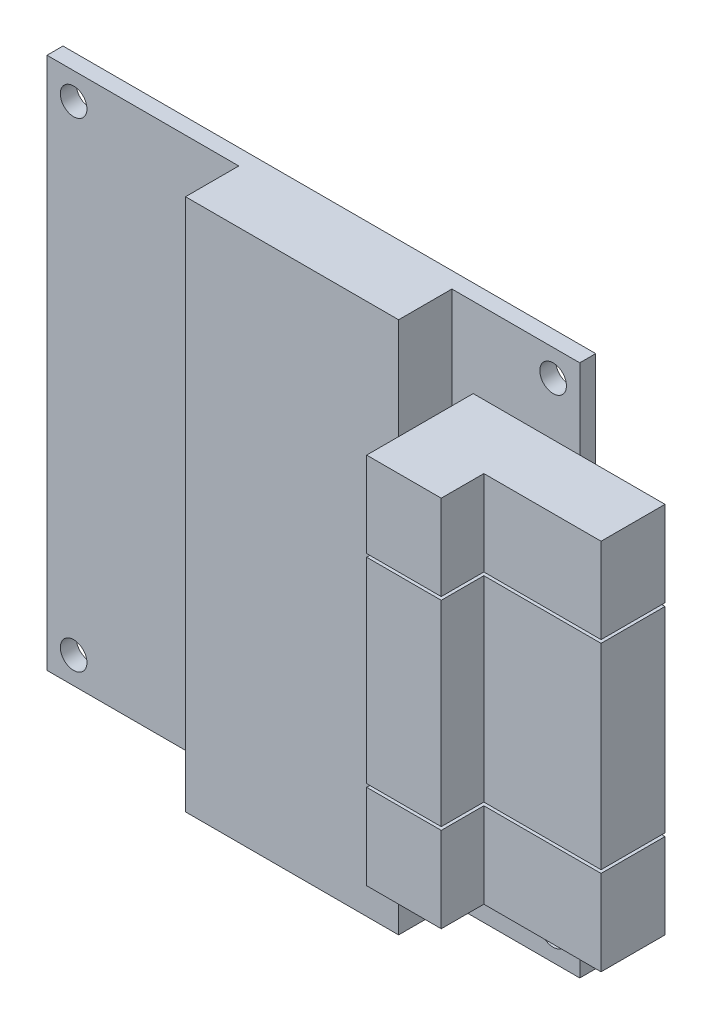
ISO-10303-21;
HEADER;
FILE_DESCRIPTION(('STEP AP214'),'2;1');
FILE_NAME('part.step','',(''),(''),'','','');
FILE_SCHEMA(('AUTOMOTIVE_DESIGN { 1 0 10303 214 1 1 1 1 }'));
ENDSEC;
DATA;
#1=APPLICATION_CONTEXT('core data for automotive mechanical design processes');
#2=APPLICATION_PROTOCOL_DEFINITION('international standard','automotive_design',2000,#1);
#3=PRODUCT_CONTEXT('',#1,'mechanical');
#4=PRODUCT('Part','Part','',(#3));
#5=PRODUCT_RELATED_PRODUCT_CATEGORY('part','',(#4));
#6=PRODUCT_DEFINITION_FORMATION('','',#4);
#7=PRODUCT_DEFINITION_CONTEXT('part definition',#1,'design');
#8=PRODUCT_DEFINITION('design','',#6,#7);
#9=PRODUCT_DEFINITION_SHAPE('','',#8);
#10=(LENGTH_UNIT() NAMED_UNIT(*) SI_UNIT(.MILLI.,.METRE.));
#11=(NAMED_UNIT(*) PLANE_ANGLE_UNIT() SI_UNIT($,.RADIAN.));
#12=(NAMED_UNIT(*) SI_UNIT($,.STERADIAN.) SOLID_ANGLE_UNIT());
#13=UNCERTAINTY_MEASURE_WITH_UNIT(LENGTH_MEASURE(1.E-05),#10,'distance_accuracy_value','');
#14=(GEOMETRIC_REPRESENTATION_CONTEXT(3) GLOBAL_UNCERTAINTY_ASSIGNED_CONTEXT((#13)) GLOBAL_UNIT_ASSIGNED_CONTEXT((#10,
#11,#12)) REPRESENTATION_CONTEXT('',''));
#15=CARTESIAN_POINT('',(0.,0.,0.));
#16=DIRECTION('',(0.,0.,1.));
#17=DIRECTION('',(1.,0.,0.));
#18=AXIS2_PLACEMENT_3D('',#15,#16,#17);
#19=CARTESIAN_POINT('',(0.,0.,1.5));
#20=DIRECTION('',(0.,0.,-1.));
#21=DIRECTION('',(-1.,0.,0.));
#22=AXIS2_PLACEMENT_3D('',#19,#20,#21);
#23=PLANE('',#22);
#24=CARTESIAN_POINT('',(22.5,-22.5,1.5));
#25=DIRECTION('',(0.,0.,1.));
#26=DIRECTION('',(1.,0.,0.));
#27=AXIS2_PLACEMENT_3D('',#24,#25,#26);
#28=CIRCLE('',#27,1.25);
#29=CARTESIAN_POINT('',(23.75,-22.5,1.5));
#30=VERTEX_POINT('',#29);
#31=EDGE_CURVE('E623',#30,#30,#28,.T.);
#32=ORIENTED_EDGE('',*,*,#31,.F.);
#33=EDGE_LOOP('',(#32));
#34=FACE_BOUND('',#33,.T.);
#35=CARTESIAN_POINT('',(22.5,22.5,1.5));
#36=DIRECTION('',(0.,0.,1.));
#37=DIRECTION('',(1.,0.,0.));
#38=AXIS2_PLACEMENT_3D('',#35,#36,#37);
#39=CIRCLE('',#38,1.25);
#40=CARTESIAN_POINT('',(23.75,22.5,1.5));
#41=VERTEX_POINT('',#40);
#42=EDGE_CURVE('E618',#41,#41,#39,.T.);
#43=ORIENTED_EDGE('',*,*,#42,.F.);
#44=EDGE_LOOP('',(#43));
#45=FACE_BOUND('',#44,.T.);
#46=DIRECTION('',(1.,0.,0.));
#47=VECTOR('',#46,1.);
#48=CARTESIAN_POINT('',(15.,-17.5,1.5));
#49=LINE('',#48,#47);
#50=CARTESIAN_POINT('',(15.,-17.5,1.5));
#51=VERTEX_POINT('',#50);
#52=CARTESIAN_POINT('',(25.,-17.5,1.5));
#53=VERTEX_POINT('',#52);
#54=EDGE_CURVE('E441',#51,#53,#49,.T.);
#55=ORIENTED_EDGE('',*,*,#54,.F.);
#56=DIRECTION('',(0.,-1.,0.));
#57=VECTOR('',#56,1.);
#58=CARTESIAN_POINT('',(15.,-17.5,1.5));
#59=LINE('',#58,#57);
#60=CARTESIAN_POINT('',(15.,-9.50000000000001,1.5));
#61=VERTEX_POINT('',#60);
#62=EDGE_CURVE('E267',#61,#51,#59,.T.);
#63=ORIENTED_EDGE('',*,*,#62,.F.);
#64=DIRECTION('',(-1.,0.,0.));
#65=VECTOR('',#64,1.);
#66=CARTESIAN_POINT('',(15.,-9.50000000000001,1.5));
#67=LINE('',#66,#65);
#68=CARTESIAN_POINT('',(25.,-9.50000000000001,1.5));
#69=VERTEX_POINT('',#68);
#70=EDGE_CURVE('E257',#69,#61,#67,.T.);
#71=ORIENTED_EDGE('',*,*,#70,.F.);
#72=DIRECTION('',(0.,1.,0.));
#73=VECTOR('',#72,1.);
#74=CARTESIAN_POINT('',(25.,25.,1.5));
#75=LINE('',#74,#73);
#76=CARTESIAN_POINT('',(25.,-9.2,1.5));
#77=VERTEX_POINT('',#76);
#78=EDGE_CURVE('E357',#69,#77,#75,.T.);
#79=ORIENTED_EDGE('',*,*,#78,.T.);
#80=DIRECTION('',(1.,0.,0.));
#81=VECTOR('',#80,1.);
#82=CARTESIAN_POINT('',(15.,-9.2,1.5));
#83=LINE('',#82,#81);
#84=CARTESIAN_POINT('',(15.,-9.2,1.5));
#85=VERTEX_POINT('',#84);
#86=EDGE_CURVE('E283',#85,#77,#83,.T.);
#87=ORIENTED_EDGE('',*,*,#86,.F.);
#88=DIRECTION('',(0.,-1.,0.));
#89=VECTOR('',#88,1.);
#90=CARTESIAN_POINT('',(15.,9.2,1.5));
#91=LINE('',#90,#89);
#92=CARTESIAN_POINT('',(15.,9.2,1.5));
#93=VERTEX_POINT('',#92);
#94=EDGE_CURVE('E286',#93,#85,#91,.T.);
#95=ORIENTED_EDGE('',*,*,#94,.F.);
#96=DIRECTION('',(-1.,0.,0.));
#97=VECTOR('',#96,1.);
#98=CARTESIAN_POINT('',(15.,9.2,1.5));
#99=LINE('',#98,#97);
#100=CARTESIAN_POINT('',(25.,9.2,1.5));
#101=VERTEX_POINT('',#100);
#102=EDGE_CURVE('E279',#101,#93,#99,.T.);
#103=ORIENTED_EDGE('',*,*,#102,.F.);
#104=CARTESIAN_POINT('',(25.,9.50000000000001,1.5));
#105=VERTEX_POINT('',#104);
#106=EDGE_CURVE('E461',#101,#105,#75,.T.);
#107=ORIENTED_EDGE('',*,*,#106,.T.);
#108=DIRECTION('',(1.,0.,0.));
#109=VECTOR('',#108,1.);
#110=CARTESIAN_POINT('',(15.,9.50000000000001,1.5));
#111=LINE('',#110,#109);
#112=CARTESIAN_POINT('',(15.,9.50000000000001,1.5));
#113=VERTEX_POINT('',#112);
#114=EDGE_CURVE('E310',#113,#105,#111,.T.);
#115=ORIENTED_EDGE('',*,*,#114,.F.);
#116=DIRECTION('',(0.,-1.,0.));
#117=VECTOR('',#116,1.);
#118=CARTESIAN_POINT('',(15.,17.5,1.5));
#119=LINE('',#118,#117);
#120=CARTESIAN_POINT('',(15.,17.5,1.5));
#121=VERTEX_POINT('',#120);
#122=EDGE_CURVE('E289',#121,#113,#119,.T.);
#123=ORIENTED_EDGE('',*,*,#122,.F.);
#124=DIRECTION('',(-1.,0.,0.));
#125=VECTOR('',#124,1.);
#126=CARTESIAN_POINT('',(0.,17.5,1.5));
#127=LINE('',#126,#125);
#128=CARTESIAN_POINT('',(25.,17.5,1.5));
#129=VERTEX_POINT('',#128);
#130=EDGE_CURVE('E241',#129,#121,#127,.T.);
#131=ORIENTED_EDGE('',*,*,#130,.F.);
#132=CARTESIAN_POINT('',(25.,25.,1.5));
#133=VERTEX_POINT('',#132);
#134=EDGE_CURVE('E377',#129,#133,#75,.T.);
#135=ORIENTED_EDGE('',*,*,#134,.T.);
#136=DIRECTION('',(-1.,0.,0.));
#137=VECTOR('',#136,1.);
#138=CARTESIAN_POINT('',(25.,25.,1.5));
#139=LINE('',#138,#137);
#140=CARTESIAN_POINT('',(13.,25.,1.5));
#141=VERTEX_POINT('',#140);
#142=EDGE_CURVE('E359',#133,#141,#139,.T.);
#143=ORIENTED_EDGE('',*,*,#142,.T.);
#144=DIRECTION('',(0.,-1.,0.));
#145=VECTOR('',#144,1.);
#146=CARTESIAN_POINT('',(13.,25.,1.5));
#147=LINE('',#146,#145);
#148=CARTESIAN_POINT('',(13.,-25.,1.5));
#149=VERTEX_POINT('',#148);
#150=EDGE_CURVE('E332',#141,#149,#147,.T.);
#151=ORIENTED_EDGE('',*,*,#150,.T.);
#152=DIRECTION('',(1.,0.,0.));
#153=VECTOR('',#152,1.);
#154=CARTESIAN_POINT('',(25.,-25.,1.5));
#155=LINE('',#154,#153);
#156=CARTESIAN_POINT('',(25.,-25.,1.5));
#157=VERTEX_POINT('',#156);
#158=EDGE_CURVE('E364',#149,#157,#155,.T.);
#159=ORIENTED_EDGE('',*,*,#158,.T.);
#160=EDGE_CURVE('E352',#157,#53,#75,.T.);
#161=ORIENTED_EDGE('',*,*,#160,.T.);
#162=EDGE_LOOP('',(#55,#63,#71,#79,#87,#95,#103,#107,#115,#123,#131,#135,#143,#151,#159,#161));
#163=FACE_BOUND('',#162,.T.);
#164=ADVANCED_FACE('F38',(#34,#45,#163),#23,.F.);
#165=CARTESIAN_POINT('',(-22.5,-22.5,1.5));
#166=DIRECTION('',(0.,0.,1.));
#167=DIRECTION('',(1.,0.,0.));
#168=AXIS2_PLACEMENT_3D('',#165,#166,#167);
#169=CIRCLE('',#168,1.25);
#170=CARTESIAN_POINT('',(-21.25,-22.5,1.5));
#171=VERTEX_POINT('',#170);
#172=EDGE_CURVE('E631',#171,#171,#169,.T.);
#173=ORIENTED_EDGE('',*,*,#172,.F.);
#174=EDGE_LOOP('',(#173));
#175=FACE_BOUND('',#174,.T.);
#176=CARTESIAN_POINT('',(-22.5,22.5,1.5));
#177=DIRECTION('',(0.,0.,1.));
#178=DIRECTION('',(1.,0.,0.));
#179=AXIS2_PLACEMENT_3D('',#176,#177,#178);
#180=CIRCLE('',#179,1.25);
#181=CARTESIAN_POINT('',(-21.25,22.5,1.5));
#182=VERTEX_POINT('',#181);
#183=EDGE_CURVE('E619',#182,#182,#180,.T.);
#184=ORIENTED_EDGE('',*,*,#183,.F.);
#185=EDGE_LOOP('',(#184));
#186=FACE_BOUND('',#185,.T.);
#187=DIRECTION('',(0.,-1.,0.));
#188=VECTOR('',#187,1.);
#189=CARTESIAN_POINT('',(-7.00000000000001,25.,1.5));
#190=LINE('',#189,#188);
#191=CARTESIAN_POINT('',(-7.00000000000001,25.,1.5));
#192=VERTEX_POINT('',#191);
#193=CARTESIAN_POINT('',(-7.,-25.,1.5));
#194=VERTEX_POINT('',#193);
#195=EDGE_CURVE('E327',#192,#194,#190,.T.);
#196=ORIENTED_EDGE('',*,*,#195,.F.);
#197=CARTESIAN_POINT('',(-25.,25.,1.5));
#198=VERTEX_POINT('',#197);
#199=EDGE_CURVE('E355',#192,#198,#139,.T.);
#200=ORIENTED_EDGE('',*,*,#199,.T.);
#201=DIRECTION('',(0.,-1.,0.));
#202=VECTOR('',#201,1.);
#203=CARTESIAN_POINT('',(-25.,25.,1.5));
#204=LINE('',#203,#202);
#205=CARTESIAN_POINT('',(-25.,-25.,1.5));
#206=VERTEX_POINT('',#205);
#207=EDGE_CURVE('E362',#198,#206,#204,.T.);
#208=ORIENTED_EDGE('',*,*,#207,.T.);
#209=EDGE_CURVE('E365',#206,#194,#155,.T.);
#210=ORIENTED_EDGE('',*,*,#209,.T.);
#211=EDGE_LOOP('',(#196,#200,#208,#210));
#212=FACE_BOUND('',#211,.T.);
#213=ADVANCED_FACE('F490',(#175,#186,#212),#23,.F.);
#214=CARTESIAN_POINT('',(25.,25.,1.5));
#215=DIRECTION('',(-1.,0.,0.));
#216=DIRECTION('',(0.,-1.,0.));
#217=AXIS2_PLACEMENT_3D('',#214,#215,#216);
#218=PLANE('',#217);
#219=DIRECTION('',(0.,1.,0.));
#220=VECTOR('',#219,1.);
#221=CARTESIAN_POINT('',(25.,25.,0.));
#222=LINE('',#221,#220);
#223=CARTESIAN_POINT('',(25.,-25.,0.));
#224=VERTEX_POINT('',#223);
#225=CARTESIAN_POINT('',(25.,25.,0.));
#226=VERTEX_POINT('',#225);
#227=EDGE_CURVE('E346',#224,#226,#222,.T.);
#228=ORIENTED_EDGE('',*,*,#227,.T.);
#229=DIRECTION('',(0.,0.,-1.));
#230=VECTOR('',#229,1.);
#231=CARTESIAN_POINT('',(25.,25.,1.5));
#232=LINE('',#231,#230);
#233=EDGE_CURVE('E386',#133,#226,#232,.T.);
#234=ORIENTED_EDGE('',*,*,#233,.F.);
#235=ORIENTED_EDGE('',*,*,#134,.F.);
#236=EDGE_CURVE('E358',#105,#129,#75,.T.);
#237=ORIENTED_EDGE('',*,*,#236,.F.);
#238=ORIENTED_EDGE('',*,*,#106,.F.);
#239=EDGE_CURVE('E462',#77,#101,#75,.T.);
#240=ORIENTED_EDGE('',*,*,#239,.F.);
#241=ORIENTED_EDGE('',*,*,#78,.F.);
#242=EDGE_CURVE('E356',#53,#69,#75,.T.);
#243=ORIENTED_EDGE('',*,*,#242,.F.);
#244=ORIENTED_EDGE('',*,*,#160,.F.);
#245=DIRECTION('',(0.,0.,-1.));
#246=VECTOR('',#245,1.);
#247=CARTESIAN_POINT('',(25.,-25.,1.5));
#248=LINE('',#247,#246);
#249=EDGE_CURVE('E368',#157,#224,#248,.T.);
#250=ORIENTED_EDGE('',*,*,#249,.T.);
#251=EDGE_LOOP('',(#228,#234,#235,#237,#238,#240,#241,#243,#244,#250));
#252=FACE_BOUND('',#251,.T.);
#253=ADVANCED_FACE('F40',(#252),#218,.F.);
#254=CARTESIAN_POINT('',(25.,25.,1.5));
#255=DIRECTION('',(0.,-1.,0.));
#256=DIRECTION('',(1.,0.,0.));
#257=AXIS2_PLACEMENT_3D('',#254,#255,#256);
#258=PLANE('',#257);
#259=DIRECTION('',(-1.,0.,0.));
#260=VECTOR('',#259,1.);
#261=CARTESIAN_POINT('',(25.,25.,0.));
#262=LINE('',#261,#260);
#263=CARTESIAN_POINT('',(-25.,25.,0.));
#264=VERTEX_POINT('',#263);
#265=EDGE_CURVE('E371',#226,#264,#262,.T.);
#266=ORIENTED_EDGE('',*,*,#265,.T.);
#267=DIRECTION('',(0.,0.,-1.));
#268=VECTOR('',#267,1.);
#269=CARTESIAN_POINT('',(-25.,25.,1.5));
#270=LINE('',#269,#268);
#271=EDGE_CURVE('E383',#198,#264,#270,.T.);
#272=ORIENTED_EDGE('',*,*,#271,.F.);
#273=ORIENTED_EDGE('',*,*,#199,.F.);
#274=DIRECTION('',(0.,0.,-1.));
#275=VECTOR('',#274,1.);
#276=CARTESIAN_POINT('',(-7.00000000000001,25.,6.5));
#277=LINE('',#276,#275);
#278=CARTESIAN_POINT('',(-7.00000000000001,25.,6.5));
#279=VERTEX_POINT('',#278);
#280=EDGE_CURVE('E349',#279,#192,#277,.T.);
#281=ORIENTED_EDGE('',*,*,#280,.F.);
#282=DIRECTION('',(-1.,0.,0.));
#283=VECTOR('',#282,1.);
#284=CARTESIAN_POINT('',(13.,25.,6.5));
#285=LINE('',#284,#283);
#286=CARTESIAN_POINT('',(13.,25.,6.5));
#287=VERTEX_POINT('',#286);
#288=EDGE_CURVE('E334',#287,#279,#285,.T.);
#289=ORIENTED_EDGE('',*,*,#288,.F.);
#290=DIRECTION('',(0.,0.,-1.));
#291=VECTOR('',#290,1.);
#292=CARTESIAN_POINT('',(13.,25.,6.5));
#293=LINE('',#292,#291);
#294=EDGE_CURVE('E347',#287,#141,#293,.T.);
#295=ORIENTED_EDGE('',*,*,#294,.T.);
#296=ORIENTED_EDGE('',*,*,#142,.F.);
#297=ORIENTED_EDGE('',*,*,#233,.T.);
#298=EDGE_LOOP('',(#266,#272,#273,#281,#289,#295,#296,#297));
#299=FACE_BOUND('',#298,.T.);
#300=ADVANCED_FACE('F472',(#299),#258,.F.);
#301=CARTESIAN_POINT('',(-25.,25.,1.5));
#302=DIRECTION('',(1.,0.,0.));
#303=DIRECTION('',(0.,0.,-1.));
#304=AXIS2_PLACEMENT_3D('',#301,#302,#303);
#305=PLANE('',#304);
#306=DIRECTION('',(0.,-1.,0.));
#307=VECTOR('',#306,1.);
#308=CARTESIAN_POINT('',(-25.,25.,0.));
#309=LINE('',#308,#307);
#310=CARTESIAN_POINT('',(-25.,-25.,0.));
#311=VERTEX_POINT('',#310);
#312=EDGE_CURVE('E373',#264,#311,#309,.T.);
#313=ORIENTED_EDGE('',*,*,#312,.T.);
#314=DIRECTION('',(0.,0.,-1.));
#315=VECTOR('',#314,1.);
#316=CARTESIAN_POINT('',(-25.,-25.,1.5));
#317=LINE('',#316,#315);
#318=EDGE_CURVE('E380',#206,#311,#317,.T.);
#319=ORIENTED_EDGE('',*,*,#318,.F.);
#320=ORIENTED_EDGE('',*,*,#207,.F.);
#321=ORIENTED_EDGE('',*,*,#271,.T.);
#322=EDGE_LOOP('',(#313,#319,#320,#321));
#323=FACE_BOUND('',#322,.T.);
#324=ADVANCED_FACE('F485',(#323),#305,.F.);
#325=CARTESIAN_POINT('',(25.,-25.,1.5));
#326=DIRECTION('',(0.,1.,0.));
#327=DIRECTION('',(-1.,0.,0.));
#328=AXIS2_PLACEMENT_3D('',#325,#326,#327);
#329=PLANE('',#328);
#330=DIRECTION('',(1.,0.,0.));
#331=VECTOR('',#330,1.);
#332=CARTESIAN_POINT('',(25.,-25.,0.));
#333=LINE('',#332,#331);
#334=EDGE_CURVE('E375',#311,#224,#333,.T.);
#335=ORIENTED_EDGE('',*,*,#334,.T.);
#336=ORIENTED_EDGE('',*,*,#249,.F.);
#337=ORIENTED_EDGE('',*,*,#158,.F.);
#338=DIRECTION('',(0.,0.,-1.));
#339=VECTOR('',#338,1.);
#340=CARTESIAN_POINT('',(13.,-25.,6.5));
#341=LINE('',#340,#339);
#342=CARTESIAN_POINT('',(13.,-25.,6.5));
#343=VERTEX_POINT('',#342);
#344=EDGE_CURVE('E344',#343,#149,#341,.T.);
#345=ORIENTED_EDGE('',*,*,#344,.F.);
#346=DIRECTION('',(-1.,0.,0.));
#347=VECTOR('',#346,1.);
#348=CARTESIAN_POINT('',(13.,-25.,6.5));
#349=LINE('',#348,#347);
#350=CARTESIAN_POINT('',(-7.,-25.,6.5));
#351=VERTEX_POINT('',#350);
#352=EDGE_CURVE('E328',#343,#351,#349,.T.);
#353=ORIENTED_EDGE('',*,*,#352,.T.);
#354=DIRECTION('',(0.,0.,-1.));
#355=VECTOR('',#354,1.);
#356=CARTESIAN_POINT('',(-7.,-25.,6.5));
#357=LINE('',#356,#355);
#358=EDGE_CURVE('E339',#351,#194,#357,.T.);
#359=ORIENTED_EDGE('',*,*,#358,.T.);
#360=ORIENTED_EDGE('',*,*,#209,.F.);
#361=ORIENTED_EDGE('',*,*,#318,.T.);
#362=EDGE_LOOP('',(#335,#336,#337,#345,#353,#359,#360,#361));
#363=FACE_BOUND('',#362,.T.);
#364=ADVANCED_FACE('F504',(#363),#329,.F.);
#365=CARTESIAN_POINT('',(0.,0.,0.));
#366=DIRECTION('',(0.,0.,-1.));
#367=DIRECTION('',(-1.,0.,0.));
#368=AXIS2_PLACEMENT_3D('',#365,#366,#367);
#369=PLANE('',#368);
#370=CARTESIAN_POINT('',(-22.5,-22.5,0.));
#371=DIRECTION('',(0.,0.,1.));
#372=DIRECTION('',(1.,0.,0.));
#373=AXIS2_PLACEMENT_3D('',#370,#371,#372);
#374=CIRCLE('',#373,1.25);
#375=CARTESIAN_POINT('',(-21.25,-22.5,0.));
#376=VERTEX_POINT('',#375);
#377=EDGE_CURVE('E634',#376,#376,#374,.T.);
#378=ORIENTED_EDGE('',*,*,#377,.T.);
#379=EDGE_LOOP('',(#378));
#380=FACE_BOUND('',#379,.T.);
#381=CARTESIAN_POINT('',(22.5,-22.5,0.));
#382=DIRECTION('',(0.,0.,1.));
#383=DIRECTION('',(1.,0.,0.));
#384=AXIS2_PLACEMENT_3D('',#381,#382,#383);
#385=CIRCLE('',#384,1.25);
#386=CARTESIAN_POINT('',(23.75,-22.5,0.));
#387=VERTEX_POINT('',#386);
#388=EDGE_CURVE('E628',#387,#387,#385,.T.);
#389=ORIENTED_EDGE('',*,*,#388,.T.);
#390=EDGE_LOOP('',(#389));
#391=FACE_BOUND('',#390,.T.);
#392=CARTESIAN_POINT('',(22.5,22.5,0.));
#393=DIRECTION('',(0.,0.,1.));
#394=DIRECTION('',(1.,0.,0.));
#395=AXIS2_PLACEMENT_3D('',#392,#393,#394);
#396=CIRCLE('',#395,1.25);
#397=CARTESIAN_POINT('',(23.75,22.5,0.));
#398=VERTEX_POINT('',#397);
#399=EDGE_CURVE('E615',#398,#398,#396,.T.);
#400=ORIENTED_EDGE('',*,*,#399,.T.);
#401=EDGE_LOOP('',(#400));
#402=FACE_BOUND('',#401,.T.);
#403=CARTESIAN_POINT('',(-22.5,22.5,0.));
#404=DIRECTION('',(0.,0.,1.));
#405=DIRECTION('',(1.,0.,0.));
#406=AXIS2_PLACEMENT_3D('',#403,#404,#405);
#407=CIRCLE('',#406,1.25);
#408=CARTESIAN_POINT('',(-21.25,22.5,0.));
#409=VERTEX_POINT('',#408);
#410=EDGE_CURVE('E249',#409,#409,#407,.T.);
#411=ORIENTED_EDGE('',*,*,#410,.T.);
#412=EDGE_LOOP('',(#411));
#413=FACE_BOUND('',#412,.T.);
#414=ORIENTED_EDGE('',*,*,#227,.F.);
#415=ORIENTED_EDGE('',*,*,#334,.F.);
#416=ORIENTED_EDGE('',*,*,#312,.F.);
#417=ORIENTED_EDGE('',*,*,#265,.F.);
#418=EDGE_LOOP('',(#414,#415,#416,#417));
#419=FACE_BOUND('',#418,.T.);
#420=ADVANCED_FACE('F479',(#380,#391,#402,#413,#419),#369,.T.);
#421=CARTESIAN_POINT('',(13.,25.,6.5));
#422=DIRECTION('',(1.,0.,0.));
#423=DIRECTION('',(0.,1.,0.));
#424=AXIS2_PLACEMENT_3D('',#421,#422,#423);
#425=PLANE('',#424);
#426=ORIENTED_EDGE('',*,*,#150,.F.);
#427=ORIENTED_EDGE('',*,*,#294,.F.);
#428=DIRECTION('',(0.,-1.,0.));
#429=VECTOR('',#428,1.);
#430=CARTESIAN_POINT('',(13.,25.,6.5));
#431=LINE('',#430,#429);
#432=EDGE_CURVE('E336',#287,#343,#431,.T.);
#433=ORIENTED_EDGE('',*,*,#432,.T.);
#434=ORIENTED_EDGE('',*,*,#344,.T.);
#435=EDGE_LOOP('',(#426,#427,#433,#434));
#436=FACE_BOUND('',#435,.T.);
#437=ADVANCED_FACE('F501',(#436),#425,.T.);
#438=CARTESIAN_POINT('',(-7.00000000000001,25.,6.5));
#439=DIRECTION('',(1.,0.,0.));
#440=DIRECTION('',(0.,1.,0.));
#441=AXIS2_PLACEMENT_3D('',#438,#439,#440);
#442=PLANE('',#441);
#443=ORIENTED_EDGE('',*,*,#195,.T.);
#444=ORIENTED_EDGE('',*,*,#358,.F.);
#445=DIRECTION('',(0.,-1.,0.));
#446=VECTOR('',#445,1.);
#447=CARTESIAN_POINT('',(-7.00000000000001,25.,6.5));
#448=LINE('',#447,#446);
#449=EDGE_CURVE('E331',#279,#351,#448,.T.);
#450=ORIENTED_EDGE('',*,*,#449,.F.);
#451=ORIENTED_EDGE('',*,*,#280,.T.);
#452=EDGE_LOOP('',(#443,#444,#450,#451));
#453=FACE_BOUND('',#452,.T.);
#454=ADVANCED_FACE('F496',(#453),#442,.F.);
#455=CARTESIAN_POINT('',(0.,0.,6.5));
#456=DIRECTION('',(0.,0.,1.));
#457=DIRECTION('',(1.,0.,0.));
#458=AXIS2_PLACEMENT_3D('',#455,#456,#457);
#459=PLANE('',#458);
#460=ORIENTED_EDGE('',*,*,#352,.F.);
#461=ORIENTED_EDGE('',*,*,#432,.F.);
#462=ORIENTED_EDGE('',*,*,#288,.T.);
#463=ORIENTED_EDGE('',*,*,#449,.T.);
#464=EDGE_LOOP('',(#460,#461,#462,#463));
#465=FACE_BOUND('',#464,.T.);
#466=ADVANCED_FACE('F499',(#465),#459,.T.);
#467=CARTESIAN_POINT('',(0.,0.,1.5));
#468=DIRECTION('',(0.,0.,1.));
#469=DIRECTION('',(1.,0.,0.));
#470=AXIS2_PLACEMENT_3D('',#467,#468,#469);
#471=PLANE('',#470);
#472=CARTESIAN_POINT('',(33.,9.50000000000001,1.5));
#473=VERTEX_POINT('',#472);
#474=EDGE_CURVE('E309',#105,#473,#111,.T.);
#475=ORIENTED_EDGE('',*,*,#474,.F.);
#476=ORIENTED_EDGE('',*,*,#236,.T.);
#477=DIRECTION('',(-1.,0.,0.));
#478=VECTOR('',#477,1.);
#479=CARTESIAN_POINT('',(15.,17.5,1.5));
#480=LINE('',#479,#478);
#481=CARTESIAN_POINT('',(33.,17.5,1.5));
#482=VERTEX_POINT('',#481);
#483=EDGE_CURVE('E301',#482,#129,#480,.T.);
#484=ORIENTED_EDGE('',*,*,#483,.F.);
#485=DIRECTION('',(0.,1.,0.));
#486=VECTOR('',#485,1.);
#487=CARTESIAN_POINT('',(33.,17.5,1.5));
#488=LINE('',#487,#486);
#489=EDGE_CURVE('E313',#473,#482,#488,.T.);
#490=ORIENTED_EDGE('',*,*,#489,.F.);
#491=EDGE_LOOP('',(#475,#476,#484,#490));
#492=FACE_BOUND('',#491,.T.);
#493=ADVANCED_FACE('F530',(#492),#471,.F.);
#494=CARTESIAN_POINT('',(15.,17.5,11.5));
#495=DIRECTION('',(1.,0.,0.));
#496=DIRECTION('',(0.,1.,0.));
#497=AXIS2_PLACEMENT_3D('',#494,#495,#496);
#498=PLANE('',#497);
#499=ORIENTED_EDGE('',*,*,#122,.T.);
#500=DIRECTION('',(0.,0.,-1.));
#501=VECTOR('',#500,1.);
#502=CARTESIAN_POINT('',(15.,9.50000000000001,11.5));
#503=LINE('',#502,#501);
#504=CARTESIAN_POINT('',(15.,9.50000000000001,11.5));
#505=VERTEX_POINT('',#504);
#506=EDGE_CURVE('E324',#505,#113,#503,.T.);
#507=ORIENTED_EDGE('',*,*,#506,.F.);
#508=DIRECTION('',(0.,-1.,0.));
#509=VECTOR('',#508,1.);
#510=CARTESIAN_POINT('',(15.,17.5,11.5));
#511=LINE('',#510,#509);
#512=CARTESIAN_POINT('',(15.,17.5,11.5));
#513=VERTEX_POINT('',#512);
#514=EDGE_CURVE('E297',#513,#505,#511,.T.);
#515=ORIENTED_EDGE('',*,*,#514,.F.);
#516=DIRECTION('',(0.,0.,-1.));
#517=VECTOR('',#516,1.);
#518=CARTESIAN_POINT('',(15.,17.5,11.5));
#519=LINE('',#518,#517);
#520=EDGE_CURVE('E306',#513,#121,#519,.T.);
#521=ORIENTED_EDGE('',*,*,#520,.T.);
#522=EDGE_LOOP('',(#499,#507,#515,#521));
#523=FACE_BOUND('',#522,.T.);
#524=ADVANCED_FACE('F399',(#523),#498,.F.);
#525=CARTESIAN_POINT('',(15.,9.50000000000001,11.5));
#526=DIRECTION('',(0.,1.,0.));
#527=DIRECTION('',(0.,0.,1.));
#528=AXIS2_PLACEMENT_3D('',#525,#526,#527);
#529=PLANE('',#528);
#530=DIRECTION('',(0.,0.,-1.));
#531=VECTOR('',#530,1.);
#532=CARTESIAN_POINT('',(33.,9.50000000000001,11.5));
#533=LINE('',#532,#531);
#534=CARTESIAN_POINT('',(33.,9.50000000000001,7.5));
#535=VERTEX_POINT('',#534);
#536=EDGE_CURVE('E322',#535,#473,#533,.T.);
#537=ORIENTED_EDGE('',*,*,#536,.F.);
#538=DIRECTION('',(-1.,0.,0.));
#539=VECTOR('',#538,1.);
#540=CARTESIAN_POINT('',(15.,9.50000000000001,7.5));
#541=LINE('',#540,#539);
#542=CARTESIAN_POINT('',(22.,9.50000000000001,7.5));
#543=VERTEX_POINT('',#542);
#544=EDGE_CURVE('E423',#535,#543,#541,.T.);
#545=ORIENTED_EDGE('',*,*,#544,.T.);
#546=DIRECTION('',(0.,0.,1.));
#547=VECTOR('',#546,1.);
#548=CARTESIAN_POINT('',(22.,9.50000000000001,11.5));
#549=LINE('',#548,#547);
#550=CARTESIAN_POINT('',(22.,9.50000000000001,11.5));
#551=VERTEX_POINT('',#550);
#552=EDGE_CURVE('E407',#543,#551,#549,.T.);
#553=ORIENTED_EDGE('',*,*,#552,.T.);
#554=DIRECTION('',(1.,0.,0.));
#555=VECTOR('',#554,1.);
#556=CARTESIAN_POINT('',(15.,9.50000000000001,11.5));
#557=LINE('',#556,#555);
#558=EDGE_CURVE('E300',#505,#551,#557,.T.);
#559=ORIENTED_EDGE('',*,*,#558,.F.);
#560=ORIENTED_EDGE('',*,*,#506,.T.);
#561=ORIENTED_EDGE('',*,*,#114,.T.);
#562=ORIENTED_EDGE('',*,*,#474,.T.);
#563=EDGE_LOOP('',(#537,#545,#553,#559,#560,#561,#562));
#564=FACE_BOUND('',#563,.T.);
#565=ADVANCED_FACE('F533',(#564),#529,.F.);
#566=CARTESIAN_POINT('',(33.,17.5,11.5));
#567=DIRECTION('',(-1.,0.,0.));
#568=DIRECTION('',(0.,0.,1.));
#569=AXIS2_PLACEMENT_3D('',#566,#567,#568);
#570=PLANE('',#569);
#571=DIRECTION('',(0.,0.,-1.));
#572=VECTOR('',#571,1.);
#573=CARTESIAN_POINT('',(33.,17.5,11.5));
#574=LINE('',#573,#572);
#575=CARTESIAN_POINT('',(33.,17.5,7.5));
#576=VERTEX_POINT('',#575);
#577=EDGE_CURVE('E320',#576,#482,#574,.T.);
#578=ORIENTED_EDGE('',*,*,#577,.F.);
#579=DIRECTION('',(0.,-1.,0.));
#580=VECTOR('',#579,1.);
#581=CARTESIAN_POINT('',(33.,25.,7.5));
#582=LINE('',#581,#580);
#583=EDGE_CURVE('E646',#576,#535,#582,.T.);
#584=ORIENTED_EDGE('',*,*,#583,.T.);
#585=ORIENTED_EDGE('',*,*,#536,.T.);
#586=ORIENTED_EDGE('',*,*,#489,.T.);
#587=EDGE_LOOP('',(#578,#584,#585,#586));
#588=FACE_BOUND('',#587,.T.);
#589=ADVANCED_FACE('F536',(#588),#570,.F.);
#590=CARTESIAN_POINT('',(15.,17.5,11.5));
#591=DIRECTION('',(0.,-1.,0.));
#592=DIRECTION('',(0.,0.,-1.));
#593=AXIS2_PLACEMENT_3D('',#590,#591,#592);
#594=PLANE('',#593);
#595=DIRECTION('',(0.,0.,-1.));
#596=VECTOR('',#595,1.);
#597=CARTESIAN_POINT('',(22.,17.5,11.5));
#598=LINE('',#597,#596);
#599=CARTESIAN_POINT('',(22.,17.5,11.5));
#600=VERTEX_POINT('',#599);
#601=CARTESIAN_POINT('',(22.,17.5,7.5));
#602=VERTEX_POINT('',#601);
#603=EDGE_CURVE('E53',#600,#602,#598,.T.);
#604=ORIENTED_EDGE('',*,*,#603,.T.);
#605=DIRECTION('',(1.,0.,0.));
#606=VECTOR('',#605,1.);
#607=CARTESIAN_POINT('',(15.,17.5,7.5));
#608=LINE('',#607,#606);
#609=EDGE_CURVE('E405',#602,#576,#608,.T.);
#610=ORIENTED_EDGE('',*,*,#609,.T.);
#611=ORIENTED_EDGE('',*,*,#577,.T.);
#612=ORIENTED_EDGE('',*,*,#483,.T.);
#613=ORIENTED_EDGE('',*,*,#130,.T.);
#614=ORIENTED_EDGE('',*,*,#520,.F.);
#615=DIRECTION('',(-1.,0.,0.));
#616=VECTOR('',#615,1.);
#617=CARTESIAN_POINT('',(15.,17.5,11.5));
#618=LINE('',#617,#616);
#619=EDGE_CURVE('E304',#600,#513,#618,.T.);
#620=ORIENTED_EDGE('',*,*,#619,.F.);
#621=EDGE_LOOP('',(#604,#610,#611,#612,#613,#614,#620));
#622=FACE_BOUND('',#621,.T.);
#623=ADVANCED_FACE('F392',(#622),#594,.F.);
#624=CARTESIAN_POINT('',(0.,0.,11.5));
#625=DIRECTION('',(0.,0.,1.));
#626=DIRECTION('',(1.,0.,0.));
#627=AXIS2_PLACEMENT_3D('',#624,#625,#626);
#628=PLANE('',#627);
#629=DIRECTION('',(0.,-1.,0.));
#630=VECTOR('',#629,1.);
#631=CARTESIAN_POINT('',(22.,25.,11.5));
#632=LINE('',#631,#630);
#633=EDGE_CURVE('E403',#600,#551,#632,.T.);
#634=ORIENTED_EDGE('',*,*,#633,.F.);
#635=ORIENTED_EDGE('',*,*,#619,.T.);
#636=ORIENTED_EDGE('',*,*,#514,.T.);
#637=ORIENTED_EDGE('',*,*,#558,.T.);
#638=EDGE_LOOP('',(#634,#635,#636,#637));
#639=FACE_BOUND('',#638,.T.);
#640=ADVANCED_FACE('F402',(#639),#628,.T.);
#641=CARTESIAN_POINT('',(0.,0.,1.5));
#642=DIRECTION('',(0.,0.,1.));
#643=DIRECTION('',(1.,0.,0.));
#644=AXIS2_PLACEMENT_3D('',#641,#642,#643);
#645=PLANE('',#644);
#646=CARTESIAN_POINT('',(33.,-9.2,1.5));
#647=VERTEX_POINT('',#646);
#648=EDGE_CURVE('E282',#77,#647,#83,.T.);
#649=ORIENTED_EDGE('',*,*,#648,.F.);
#650=ORIENTED_EDGE('',*,*,#239,.T.);
#651=CARTESIAN_POINT('',(33.,9.2,1.5));
#652=VERTEX_POINT('',#651);
#653=EDGE_CURVE('E275',#652,#101,#99,.T.);
#654=ORIENTED_EDGE('',*,*,#653,.F.);
#655=DIRECTION('',(0.,1.,0.));
#656=VECTOR('',#655,1.);
#657=CARTESIAN_POINT('',(33.,9.2,1.5));
#658=LINE('',#657,#656);
#659=EDGE_CURVE('E278',#647,#652,#658,.T.);
#660=ORIENTED_EDGE('',*,*,#659,.F.);
#661=EDGE_LOOP('',(#649,#650,#654,#660));
#662=FACE_BOUND('',#661,.T.);
#663=ADVANCED_FACE('F547',(#662),#645,.F.);
#664=CARTESIAN_POINT('',(15.,9.2,11.5));
#665=DIRECTION('',(1.,0.,0.));
#666=DIRECTION('',(0.,0.,-1.));
#667=AXIS2_PLACEMENT_3D('',#664,#665,#666);
#668=PLANE('',#667);
#669=ORIENTED_EDGE('',*,*,#94,.T.);
#670=DIRECTION('',(0.,0.,-1.));
#671=VECTOR('',#670,1.);
#672=CARTESIAN_POINT('',(15.,-9.2,11.5));
#673=LINE('',#672,#671);
#674=CARTESIAN_POINT('',(15.,-9.2,11.5));
#675=VERTEX_POINT('',#674);
#676=EDGE_CURVE('E263',#675,#85,#673,.T.);
#677=ORIENTED_EDGE('',*,*,#676,.F.);
#678=DIRECTION('',(0.,-1.,0.));
#679=VECTOR('',#678,1.);
#680=CARTESIAN_POINT('',(15.,9.2,11.5));
#681=LINE('',#680,#679);
#682=CARTESIAN_POINT('',(15.,9.2,11.5));
#683=VERTEX_POINT('',#682);
#684=EDGE_CURVE('E294',#683,#675,#681,.T.);
#685=ORIENTED_EDGE('',*,*,#684,.F.);
#686=DIRECTION('',(0.,0.,-1.));
#687=VECTOR('',#686,1.);
#688=CARTESIAN_POINT('',(15.,9.2,11.5));
#689=LINE('',#688,#687);
#690=EDGE_CURVE('E271',#683,#93,#689,.T.);
#691=ORIENTED_EDGE('',*,*,#690,.T.);
#692=EDGE_LOOP('',(#669,#677,#685,#691));
#693=FACE_BOUND('',#692,.T.);
#694=ADVANCED_FACE('F555',(#693),#668,.F.);
#695=CARTESIAN_POINT('',(15.,-9.2,11.5));
#696=DIRECTION('',(0.,1.,0.));
#697=DIRECTION('',(0.,0.,1.));
#698=AXIS2_PLACEMENT_3D('',#695,#696,#697);
#699=PLANE('',#698);
#700=DIRECTION('',(0.,0.,-1.));
#701=VECTOR('',#700,1.);
#702=CARTESIAN_POINT('',(33.,-9.2,11.5));
#703=LINE('',#702,#701);
#704=CARTESIAN_POINT('',(33.,-9.2,7.5));
#705=VERTEX_POINT('',#704);
#706=EDGE_CURVE('E266',#705,#647,#703,.T.);
#707=ORIENTED_EDGE('',*,*,#706,.F.);
#708=DIRECTION('',(-1.,0.,0.));
#709=VECTOR('',#708,1.);
#710=CARTESIAN_POINT('',(15.,-9.2,7.5));
#711=LINE('',#710,#709);
#712=CARTESIAN_POINT('',(22.,-9.2,7.5));
#713=VERTEX_POINT('',#712);
#714=EDGE_CURVE('E419',#705,#713,#711,.T.);
#715=ORIENTED_EDGE('',*,*,#714,.T.);
#716=DIRECTION('',(0.,0.,1.));
#717=VECTOR('',#716,1.);
#718=CARTESIAN_POINT('',(22.,-9.2,11.5));
#719=LINE('',#718,#717);
#720=CARTESIAN_POINT('',(22.,-9.2,11.5));
#721=VERTEX_POINT('',#720);
#722=EDGE_CURVE('E408',#713,#721,#719,.T.);
#723=ORIENTED_EDGE('',*,*,#722,.T.);
#724=DIRECTION('',(1.,0.,0.));
#725=VECTOR('',#724,1.);
#726=CARTESIAN_POINT('',(15.,-9.2,11.5));
#727=LINE('',#726,#725);
#728=EDGE_CURVE('E291',#675,#721,#727,.T.);
#729=ORIENTED_EDGE('',*,*,#728,.F.);
#730=ORIENTED_EDGE('',*,*,#676,.T.);
#731=ORIENTED_EDGE('',*,*,#86,.T.);
#732=ORIENTED_EDGE('',*,*,#648,.T.);
#733=EDGE_LOOP('',(#707,#715,#723,#729,#730,#731,#732));
#734=FACE_BOUND('',#733,.T.);
#735=ADVANCED_FACE('F563',(#734),#699,.F.);
#736=CARTESIAN_POINT('',(33.,9.2,11.5));
#737=DIRECTION('',(-1.,0.,0.));
#738=DIRECTION('',(0.,0.,1.));
#739=AXIS2_PLACEMENT_3D('',#736,#737,#738);
#740=PLANE('',#739);
#741=DIRECTION('',(0.,0.,-1.));
#742=VECTOR('',#741,1.);
#743=CARTESIAN_POINT('',(33.,9.2,11.5));
#744=LINE('',#743,#742);
#745=CARTESIAN_POINT('',(33.,9.2,7.5));
#746=VERTEX_POINT('',#745);
#747=EDGE_CURVE('E269',#746,#652,#744,.T.);
#748=ORIENTED_EDGE('',*,*,#747,.F.);
#749=EDGE_CURVE('E644',#746,#705,#582,.T.);
#750=ORIENTED_EDGE('',*,*,#749,.T.);
#751=ORIENTED_EDGE('',*,*,#706,.T.);
#752=ORIENTED_EDGE('',*,*,#659,.T.);
#753=EDGE_LOOP('',(#748,#750,#751,#752));
#754=FACE_BOUND('',#753,.T.);
#755=ADVANCED_FACE('F559',(#754),#740,.F.);
#756=CARTESIAN_POINT('',(15.,9.2,11.5));
#757=DIRECTION('',(0.,-1.,0.));
#758=DIRECTION('',(0.,0.,-1.));
#759=AXIS2_PLACEMENT_3D('',#756,#757,#758);
#760=PLANE('',#759);
#761=DIRECTION('',(0.,0.,-1.));
#762=VECTOR('',#761,1.);
#763=CARTESIAN_POINT('',(22.,9.2,11.5));
#764=LINE('',#763,#762);
#765=CARTESIAN_POINT('',(22.,9.2,11.5));
#766=VERTEX_POINT('',#765);
#767=CARTESIAN_POINT('',(22.,9.2,7.5));
#768=VERTEX_POINT('',#767);
#769=EDGE_CURVE('E61',#766,#768,#764,.T.);
#770=ORIENTED_EDGE('',*,*,#769,.T.);
#771=DIRECTION('',(1.,0.,0.));
#772=VECTOR('',#771,1.);
#773=CARTESIAN_POINT('',(15.,9.2,7.5));
#774=LINE('',#773,#772);
#775=EDGE_CURVE('E411',#768,#746,#774,.T.);
#776=ORIENTED_EDGE('',*,*,#775,.T.);
#777=ORIENTED_EDGE('',*,*,#747,.T.);
#778=ORIENTED_EDGE('',*,*,#653,.T.);
#779=ORIENTED_EDGE('',*,*,#102,.T.);
#780=ORIENTED_EDGE('',*,*,#690,.F.);
#781=DIRECTION('',(-1.,0.,0.));
#782=VECTOR('',#781,1.);
#783=CARTESIAN_POINT('',(15.,9.2,11.5));
#784=LINE('',#783,#782);
#785=EDGE_CURVE('E274',#766,#683,#784,.T.);
#786=ORIENTED_EDGE('',*,*,#785,.F.);
#787=EDGE_LOOP('',(#770,#776,#777,#778,#779,#780,#786));
#788=FACE_BOUND('',#787,.T.);
#789=ADVANCED_FACE('F551',(#788),#760,.F.);
#790=CARTESIAN_POINT('',(0.,0.,11.5));
#791=DIRECTION('',(0.,0.,1.));
#792=DIRECTION('',(1.,0.,0.));
#793=AXIS2_PLACEMENT_3D('',#790,#791,#792);
#794=PLANE('',#793);
#795=EDGE_CURVE('E640',#766,#721,#632,.T.);
#796=ORIENTED_EDGE('',*,*,#795,.F.);
#797=ORIENTED_EDGE('',*,*,#785,.T.);
#798=ORIENTED_EDGE('',*,*,#684,.T.);
#799=ORIENTED_EDGE('',*,*,#728,.T.);
#800=EDGE_LOOP('',(#796,#797,#798,#799));
#801=FACE_BOUND('',#800,.T.);
#802=ADVANCED_FACE('F548',(#801),#794,.T.);
#803=CARTESIAN_POINT('',(0.,0.,1.5));
#804=DIRECTION('',(0.,0.,-1.));
#805=DIRECTION('',(-1.,0.,0.));
#806=AXIS2_PLACEMENT_3D('',#803,#804,#805);
#807=PLANE('',#806);
#808=ORIENTED_EDGE('',*,*,#242,.T.);
#809=CARTESIAN_POINT('',(33.,-9.50000000000001,1.5));
#810=VERTEX_POINT('',#809);
#811=EDGE_CURVE('E434',#810,#69,#67,.T.);
#812=ORIENTED_EDGE('',*,*,#811,.F.);
#813=DIRECTION('',(0.,1.,0.));
#814=VECTOR('',#813,1.);
#815=CARTESIAN_POINT('',(33.,-17.5,1.5));
#816=LINE('',#815,#814);
#817=CARTESIAN_POINT('',(33.,-17.5,1.5));
#818=VERTEX_POINT('',#817);
#819=EDGE_CURVE('E437',#818,#810,#816,.T.);
#820=ORIENTED_EDGE('',*,*,#819,.F.);
#821=EDGE_CURVE('E440',#53,#818,#49,.T.);
#822=ORIENTED_EDGE('',*,*,#821,.F.);
#823=EDGE_LOOP('',(#808,#812,#820,#822));
#824=FACE_BOUND('',#823,.T.);
#825=ADVANCED_FACE('F456',(#824),#807,.T.);
#826=CARTESIAN_POINT('',(15.,-17.5,11.5));
#827=DIRECTION('',(1.,0.,0.));
#828=DIRECTION('',(0.,1.,0.));
#829=AXIS2_PLACEMENT_3D('',#826,#827,#828);
#830=PLANE('',#829);
#831=ORIENTED_EDGE('',*,*,#62,.T.);
#832=DIRECTION('',(0.,0.,-1.));
#833=VECTOR('',#832,1.);
#834=CARTESIAN_POINT('',(15.,-17.5,11.5));
#835=LINE('',#834,#833);
#836=CARTESIAN_POINT('',(15.,-17.5,11.5));
#837=VERTEX_POINT('',#836);
#838=EDGE_CURVE('E426',#837,#51,#835,.T.);
#839=ORIENTED_EDGE('',*,*,#838,.F.);
#840=DIRECTION('',(0.,-1.,0.));
#841=VECTOR('',#840,1.);
#842=CARTESIAN_POINT('',(15.,-17.5,11.5));
#843=LINE('',#842,#841);
#844=CARTESIAN_POINT('',(15.,-9.50000000000001,11.5));
#845=VERTEX_POINT('',#844);
#846=EDGE_CURVE('E253',#845,#837,#843,.T.);
#847=ORIENTED_EDGE('',*,*,#846,.F.);
#848=DIRECTION('',(0.,0.,-1.));
#849=VECTOR('',#848,1.);
#850=CARTESIAN_POINT('',(15.,-9.50000000000001,11.5));
#851=LINE('',#850,#849);
#852=EDGE_CURVE('E259',#845,#61,#851,.T.);
#853=ORIENTED_EDGE('',*,*,#852,.T.);
#854=EDGE_LOOP('',(#831,#839,#847,#853));
#855=FACE_BOUND('',#854,.T.);
#856=ADVANCED_FACE('F445',(#855),#830,.F.);
#857=CARTESIAN_POINT('',(15.,-17.5,11.5));
#858=DIRECTION('',(0.,1.,0.));
#859=DIRECTION('',(0.,0.,1.));
#860=AXIS2_PLACEMENT_3D('',#857,#858,#859);
#861=PLANE('',#860);
#862=DIRECTION('',(0.,0.,-1.));
#863=VECTOR('',#862,1.);
#864=CARTESIAN_POINT('',(33.,-17.5,11.5));
#865=LINE('',#864,#863);
#866=CARTESIAN_POINT('',(33.,-17.5,7.5));
#867=VERTEX_POINT('',#866);
#868=EDGE_CURVE('E428',#867,#818,#865,.T.);
#869=ORIENTED_EDGE('',*,*,#868,.F.);
#870=DIRECTION('',(1.,0.,0.));
#871=VECTOR('',#870,1.);
#872=CARTESIAN_POINT('',(33.,-17.5,7.5));
#873=LINE('',#872,#871);
#874=CARTESIAN_POINT('',(22.,-17.5,7.5));
#875=VERTEX_POINT('',#874);
#876=EDGE_CURVE('E248',#875,#867,#873,.T.);
#877=ORIENTED_EDGE('',*,*,#876,.F.);
#878=DIRECTION('',(0.,0.,-1.));
#879=VECTOR('',#878,1.);
#880=CARTESIAN_POINT('',(22.,-17.5,11.5));
#881=LINE('',#880,#879);
#882=CARTESIAN_POINT('',(22.,-17.5,11.5));
#883=VERTEX_POINT('',#882);
#884=EDGE_CURVE('E234',#883,#875,#881,.T.);
#885=ORIENTED_EDGE('',*,*,#884,.F.);
#886=DIRECTION('',(1.,0.,0.));
#887=VECTOR('',#886,1.);
#888=CARTESIAN_POINT('',(15.,-17.5,11.5));
#889=LINE('',#888,#887);
#890=EDGE_CURVE('E246',#837,#883,#889,.T.);
#891=ORIENTED_EDGE('',*,*,#890,.F.);
#892=ORIENTED_EDGE('',*,*,#838,.T.);
#893=ORIENTED_EDGE('',*,*,#54,.T.);
#894=ORIENTED_EDGE('',*,*,#821,.T.);
#895=EDGE_LOOP('',(#869,#877,#885,#891,#892,#893,#894));
#896=FACE_BOUND('',#895,.T.);
#897=ADVANCED_FACE('F244',(#896),#861,.F.);
#898=CARTESIAN_POINT('',(33.,-17.5,11.5));
#899=DIRECTION('',(-1.,0.,0.));
#900=DIRECTION('',(0.,0.,1.));
#901=AXIS2_PLACEMENT_3D('',#898,#899,#900);
#902=PLANE('',#901);
#903=DIRECTION('',(0.,0.,-1.));
#904=VECTOR('',#903,1.);
#905=CARTESIAN_POINT('',(33.,-9.50000000000001,11.5));
#906=LINE('',#905,#904);
#907=CARTESIAN_POINT('',(33.,-9.50000000000001,7.5));
#908=VERTEX_POINT('',#907);
#909=EDGE_CURVE('E430',#908,#810,#906,.T.);
#910=ORIENTED_EDGE('',*,*,#909,.F.);
#911=EDGE_CURVE('E641',#908,#867,#582,.T.);
#912=ORIENTED_EDGE('',*,*,#911,.T.);
#913=ORIENTED_EDGE('',*,*,#868,.T.);
#914=ORIENTED_EDGE('',*,*,#819,.T.);
#915=EDGE_LOOP('',(#910,#912,#913,#914));
#916=FACE_BOUND('',#915,.T.);
#917=ADVANCED_FACE('F577',(#916),#902,.F.);
#918=CARTESIAN_POINT('',(15.,-9.50000000000001,11.5));
#919=DIRECTION('',(0.,-1.,0.));
#920=DIRECTION('',(0.,0.,-1.));
#921=AXIS2_PLACEMENT_3D('',#918,#919,#920);
#922=PLANE('',#921);
#923=DIRECTION('',(0.,0.,-1.));
#924=VECTOR('',#923,1.);
#925=CARTESIAN_POINT('',(22.,-9.50000000000001,11.5));
#926=LINE('',#925,#924);
#927=CARTESIAN_POINT('',(22.,-9.50000000000001,11.5));
#928=VERTEX_POINT('',#927);
#929=CARTESIAN_POINT('',(22.,-9.50000000000001,7.5));
#930=VERTEX_POINT('',#929);
#931=EDGE_CURVE('E237',#928,#930,#926,.T.);
#932=ORIENTED_EDGE('',*,*,#931,.T.);
#933=DIRECTION('',(1.,0.,0.));
#934=VECTOR('',#933,1.);
#935=CARTESIAN_POINT('',(15.,-9.50000000000001,7.5));
#936=LINE('',#935,#934);
#937=EDGE_CURVE('E11',#930,#908,#936,.T.);
#938=ORIENTED_EDGE('',*,*,#937,.T.);
#939=ORIENTED_EDGE('',*,*,#909,.T.);
#940=ORIENTED_EDGE('',*,*,#811,.T.);
#941=ORIENTED_EDGE('',*,*,#70,.T.);
#942=ORIENTED_EDGE('',*,*,#852,.F.);
#943=DIRECTION('',(-1.,0.,0.));
#944=VECTOR('',#943,1.);
#945=CARTESIAN_POINT('',(15.,-9.50000000000001,11.5));
#946=LINE('',#945,#944);
#947=EDGE_CURVE('E255',#928,#845,#946,.T.);
#948=ORIENTED_EDGE('',*,*,#947,.F.);
#949=EDGE_LOOP('',(#932,#938,#939,#940,#941,#942,#948));
#950=FACE_BOUND('',#949,.T.);
#951=ADVANCED_FACE('F451',(#950),#922,.F.);
#952=CARTESIAN_POINT('',(0.,0.,11.5));
#953=DIRECTION('',(0.,0.,-1.));
#954=DIRECTION('',(-1.,0.,0.));
#955=AXIS2_PLACEMENT_3D('',#952,#953,#954);
#956=PLANE('',#955);
#957=ORIENTED_EDGE('',*,*,#890,.T.);
#958=DIRECTION('',(0.,1.,0.));
#959=VECTOR('',#958,1.);
#960=CARTESIAN_POINT('',(22.,0.,11.5));
#961=LINE('',#960,#959);
#962=EDGE_CURVE('E46',#883,#928,#961,.T.);
#963=ORIENTED_EDGE('',*,*,#962,.T.);
#964=ORIENTED_EDGE('',*,*,#947,.T.);
#965=ORIENTED_EDGE('',*,*,#846,.T.);
#966=EDGE_LOOP('',(#957,#963,#964,#965));
#967=FACE_BOUND('',#966,.T.);
#968=ADVANCED_FACE('F251',(#967),#956,.F.);
#969=CARTESIAN_POINT('',(22.,25.,11.5));
#970=DIRECTION('',(-1.,0.,0.));
#971=DIRECTION('',(0.,0.,1.));
#972=AXIS2_PLACEMENT_3D('',#969,#970,#971);
#973=PLANE('',#972);
#974=ORIENTED_EDGE('',*,*,#962,.F.);
#975=ORIENTED_EDGE('',*,*,#884,.T.);
#976=DIRECTION('',(0.,-1.,0.));
#977=VECTOR('',#976,1.);
#978=CARTESIAN_POINT('',(22.,25.,7.5));
#979=LINE('',#978,#977);
#980=EDGE_CURVE('E647',#930,#875,#979,.T.);
#981=ORIENTED_EDGE('',*,*,#980,.F.);
#982=ORIENTED_EDGE('',*,*,#931,.F.);
#983=EDGE_LOOP('',(#974,#975,#981,#982));
#984=FACE_BOUND('',#983,.T.);
#985=ADVANCED_FACE('F232',(#984),#973,.F.);
#986=CARTESIAN_POINT('',(33.,25.,7.5));
#987=DIRECTION('',(0.,0.,-1.));
#988=DIRECTION('',(-1.,0.,0.));
#989=AXIS2_PLACEMENT_3D('',#986,#987,#988);
#990=PLANE('',#989);
#991=ORIENTED_EDGE('',*,*,#980,.T.);
#992=ORIENTED_EDGE('',*,*,#876,.T.);
#993=ORIENTED_EDGE('',*,*,#911,.F.);
#994=ORIENTED_EDGE('',*,*,#937,.F.);
#995=EDGE_LOOP('',(#991,#992,#993,#994));
#996=FACE_BOUND('',#995,.T.);
#997=ADVANCED_FACE('F595',(#996),#990,.F.);
#998=EDGE_CURVE('E649',#768,#713,#979,.T.);
#999=ORIENTED_EDGE('',*,*,#998,.F.);
#1000=ORIENTED_EDGE('',*,*,#769,.F.);
#1001=ORIENTED_EDGE('',*,*,#795,.T.);
#1002=ORIENTED_EDGE('',*,*,#722,.F.);
#1003=EDGE_LOOP('',(#999,#1000,#1001,#1002));
#1004=FACE_BOUND('',#1003,.T.);
#1005=ADVANCED_FACE('F590',(#1004),#973,.F.);
#1006=ORIENTED_EDGE('',*,*,#749,.F.);
#1007=ORIENTED_EDGE('',*,*,#775,.F.);
#1008=ORIENTED_EDGE('',*,*,#998,.T.);
#1009=ORIENTED_EDGE('',*,*,#714,.F.);
#1010=EDGE_LOOP('',(#1006,#1007,#1008,#1009));
#1011=FACE_BOUND('',#1010,.T.);
#1012=ADVANCED_FACE('F593',(#1011),#990,.F.);
#1013=ORIENTED_EDGE('',*,*,#583,.F.);
#1014=ORIENTED_EDGE('',*,*,#609,.F.);
#1015=EDGE_CURVE('E645',#602,#543,#979,.T.);
#1016=ORIENTED_EDGE('',*,*,#1015,.T.);
#1017=ORIENTED_EDGE('',*,*,#544,.F.);
#1018=EDGE_LOOP('',(#1013,#1014,#1016,#1017));
#1019=FACE_BOUND('',#1018,.T.);
#1020=ADVANCED_FACE('F589',(#1019),#990,.F.);
#1021=ORIENTED_EDGE('',*,*,#1015,.F.);
#1022=ORIENTED_EDGE('',*,*,#603,.F.);
#1023=ORIENTED_EDGE('',*,*,#633,.T.);
#1024=ORIENTED_EDGE('',*,*,#552,.F.);
#1025=EDGE_LOOP('',(#1021,#1022,#1023,#1024));
#1026=FACE_BOUND('',#1025,.T.);
#1027=ADVANCED_FACE('F585',(#1026),#973,.F.);
#1028=CARTESIAN_POINT('',(-22.5,22.5,0.));
#1029=DIRECTION('',(0.,0.,1.));
#1030=DIRECTION('',(1.,0.,0.));
#1031=AXIS2_PLACEMENT_3D('',#1028,#1029,#1030);
#1032=CYLINDRICAL_SURFACE('',#1031,1.25);
#1033=ORIENTED_EDGE('',*,*,#410,.F.);
#1034=EDGE_LOOP('',(#1033));
#1035=FACE_BOUND('',#1034,.T.);
#1036=ORIENTED_EDGE('',*,*,#183,.T.);
#1037=EDGE_LOOP('',(#1036));
#1038=FACE_BOUND('',#1037,.T.);
#1039=ADVANCED_FACE('F588',(#1035,#1038),#1032,.F.);
#1040=CARTESIAN_POINT('',(22.5,22.5,0.));
#1041=DIRECTION('',(0.,0.,1.));
#1042=DIRECTION('',(1.,0.,0.));
#1043=AXIS2_PLACEMENT_3D('',#1040,#1041,#1042);
#1044=CYLINDRICAL_SURFACE('',#1043,1.25);
#1045=ORIENTED_EDGE('',*,*,#399,.F.);
#1046=EDGE_LOOP('',(#1045));
#1047=FACE_BOUND('',#1046,.T.);
#1048=ORIENTED_EDGE('',*,*,#42,.T.);
#1049=EDGE_LOOP('',(#1048));
#1050=FACE_BOUND('',#1049,.T.);
#1051=ADVANCED_FACE('F598',(#1047,#1050),#1044,.F.);
#1052=CARTESIAN_POINT('',(22.5,-22.5,0.));
#1053=DIRECTION('',(0.,0.,1.));
#1054=DIRECTION('',(1.,0.,0.));
#1055=AXIS2_PLACEMENT_3D('',#1052,#1053,#1054);
#1056=CYLINDRICAL_SURFACE('',#1055,1.25);
#1057=ORIENTED_EDGE('',*,*,#388,.F.);
#1058=EDGE_LOOP('',(#1057));
#1059=FACE_BOUND('',#1058,.T.);
#1060=ORIENTED_EDGE('',*,*,#31,.T.);
#1061=EDGE_LOOP('',(#1060));
#1062=FACE_BOUND('',#1061,.T.);
#1063=ADVANCED_FACE('F603',(#1059,#1062),#1056,.F.);
#1064=CARTESIAN_POINT('',(-22.5,-22.5,0.));
#1065=DIRECTION('',(0.,0.,1.));
#1066=DIRECTION('',(1.,0.,0.));
#1067=AXIS2_PLACEMENT_3D('',#1064,#1065,#1066);
#1068=CYLINDRICAL_SURFACE('',#1067,1.25);
#1069=ORIENTED_EDGE('',*,*,#377,.F.);
#1070=EDGE_LOOP('',(#1069));
#1071=FACE_BOUND('',#1070,.T.);
#1072=ORIENTED_EDGE('',*,*,#172,.T.);
#1073=EDGE_LOOP('',(#1072));
#1074=FACE_BOUND('',#1073,.T.);
#1075=ADVANCED_FACE('F600',(#1071,#1074),#1068,.F.);
#1076=CLOSED_SHELL('',(#164,#213,#253,#300,#324,#364,#420,#437,#454,#466,#493,#524,#565,#589,
#623,#640,#663,#694,#735,#755,#789,#802,#825,#856,#897,#917,#951,#968,#985,#997,#1005,#1012,
#1020,#1027,#1039,#1051,#1063,#1075));
#1077=MANIFOLD_SOLID_BREP('B2',#1076);
#1078=ADVANCED_BREP_SHAPE_REPRESENTATION('',(#18,#1077),#14);
#1079=SHAPE_DEFINITION_REPRESENTATION(#9,#1078);
ENDSEC;
END-ISO-10303-21;
